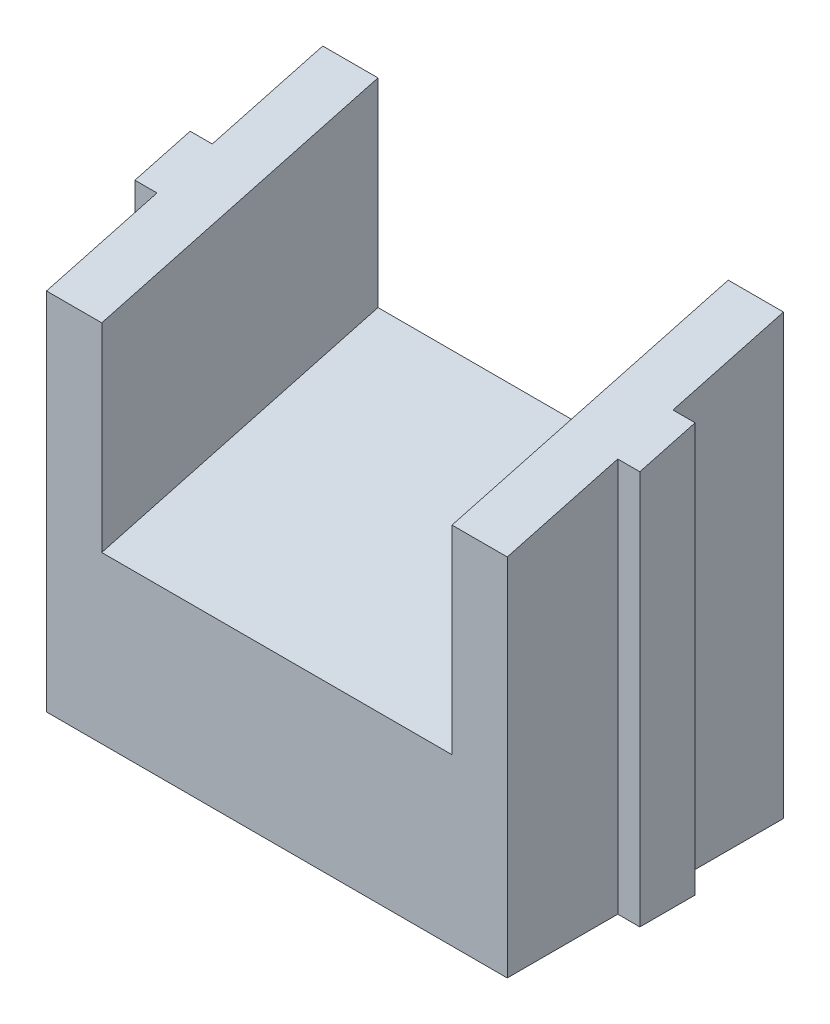
ISO-10303-21;
HEADER;
FILE_DESCRIPTION(('STEP AP214'),'2;1');
FILE_NAME('part.step','',(''),(''),'','','');
FILE_SCHEMA(('AUTOMOTIVE_DESIGN { 1 0 10303 214 1 1 1 1 }'));
ENDSEC;
DATA;
#1=APPLICATION_CONTEXT('core data for automotive mechanical design processes');
#2=APPLICATION_PROTOCOL_DEFINITION('international standard','automotive_design',2000,#1);
#3=PRODUCT_CONTEXT('',#1,'mechanical');
#4=PRODUCT('Part','Part','',(#3));
#5=PRODUCT_RELATED_PRODUCT_CATEGORY('part','',(#4));
#6=PRODUCT_DEFINITION_FORMATION('','',#4);
#7=PRODUCT_DEFINITION_CONTEXT('part definition',#1,'design');
#8=PRODUCT_DEFINITION('design','',#6,#7);
#9=PRODUCT_DEFINITION_SHAPE('','',#8);
#10=(LENGTH_UNIT() NAMED_UNIT(*) SI_UNIT(.MILLI.,.METRE.));
#11=(NAMED_UNIT(*) PLANE_ANGLE_UNIT() SI_UNIT($,.RADIAN.));
#12=(NAMED_UNIT(*) SI_UNIT($,.STERADIAN.) SOLID_ANGLE_UNIT());
#13=UNCERTAINTY_MEASURE_WITH_UNIT(LENGTH_MEASURE(1.E-05),#10,'distance_accuracy_value','');
#14=(GEOMETRIC_REPRESENTATION_CONTEXT(3) GLOBAL_UNCERTAINTY_ASSIGNED_CONTEXT((#13)) GLOBAL_UNIT_ASSIGNED_CONTEXT((#10,
#11,#12)) REPRESENTATION_CONTEXT('',''));
#15=CARTESIAN_POINT('',(0.,0.,0.));
#16=DIRECTION('',(0.,0.,1.));
#17=DIRECTION('',(1.,0.,0.));
#18=AXIS2_PLACEMENT_3D('',#15,#16,#17);
#19=CARTESIAN_POINT('',(0.,15.,0.));
#20=DIRECTION('',(-1.,0.,0.));
#21=DIRECTION('',(0.,0.,1.));
#22=AXIS2_PLACEMENT_3D('',#19,#20,#21);
#23=PLANE('',#22);
#24=DIRECTION('',(0.,-0.258819045102522,0.965925826289068));
#25=VECTOR('',#24,1.);
#26=CARTESIAN_POINT('',(0.,31.9951905283833,3.75000000000001));
#27=LINE('',#26,#25);
#28=CARTESIAN_POINT('',(0.,35.6794919243112,-10.));
#29=VERTEX_POINT('',#28);
#30=CARTESIAN_POINT('',(0.,33.,0.));
#31=VERTEX_POINT('',#30);
#32=EDGE_CURVE('E175',#29,#31,#27,.T.);
#33=ORIENTED_EDGE('',*,*,#32,.F.);
#34=DIRECTION('',(0.,-1.,0.));
#35=VECTOR('',#34,1.);
#36=CARTESIAN_POINT('',(0.,15.,-10.));
#37=LINE('',#36,#35);
#38=CARTESIAN_POINT('',(0.,0.,-10.));
#39=VERTEX_POINT('',#38);
#40=EDGE_CURVE('E49',#29,#39,#37,.T.);
#41=ORIENTED_EDGE('',*,*,#40,.T.);
#42=DIRECTION('',(0.,0.,-1.));
#43=VECTOR('',#42,1.);
#44=CARTESIAN_POINT('',(0.,0.,0.));
#45=LINE('',#44,#43);
#46=CARTESIAN_POINT('',(0.,0.,0.));
#47=VERTEX_POINT('',#46);
#48=EDGE_CURVE('E203',#47,#39,#45,.T.);
#49=ORIENTED_EDGE('',*,*,#48,.F.);
#50=DIRECTION('',(0.,-1.,0.));
#51=VECTOR('',#50,1.);
#52=CARTESIAN_POINT('',(0.,15.,0.));
#53=LINE('',#52,#51);
#54=EDGE_CURVE('E237',#31,#47,#53,.T.);
#55=ORIENTED_EDGE('',*,*,#54,.F.);
#56=EDGE_LOOP('',(#33,#41,#49,#55));
#57=FACE_BOUND('',#56,.T.);
#58=ADVANCED_FACE('F34',(#57),#23,.T.);
#59=DIRECTION('',(0.,-1.,0.));
#60=VECTOR('',#59,1.);
#61=CARTESIAN_POINT('',(0.,15.,-15.));
#62=LINE('',#61,#60);
#63=CARTESIAN_POINT('',(0.,37.0192378864669,-15.));
#64=VERTEX_POINT('',#63);
#65=CARTESIAN_POINT('',(0.,0.,-15.));
#66=VERTEX_POINT('',#65);
#67=EDGE_CURVE('E149',#64,#66,#62,.T.);
#68=ORIENTED_EDGE('',*,*,#67,.F.);
#69=CARTESIAN_POINT('',(0.,39.6987298107781,-25.));
#70=VERTEX_POINT('',#69);
#71=EDGE_CURVE('E153',#70,#64,#27,.T.);
#72=ORIENTED_EDGE('',*,*,#71,.F.);
#73=DIRECTION('',(0.,-1.,0.));
#74=VECTOR('',#73,1.);
#75=CARTESIAN_POINT('',(0.,15.,-25.));
#76=LINE('',#75,#74);
#77=CARTESIAN_POINT('',(0.,0.,-25.));
#78=VERTEX_POINT('',#77);
#79=EDGE_CURVE('E159',#70,#78,#76,.T.);
#80=ORIENTED_EDGE('',*,*,#79,.T.);
#81=EDGE_CURVE('E155',#66,#78,#45,.T.);
#82=ORIENTED_EDGE('',*,*,#81,.F.);
#83=EDGE_LOOP('',(#68,#72,#80,#82));
#84=FACE_BOUND('',#83,.T.);
#85=ADVANCED_FACE('F151',(#84),#23,.T.);
#86=CARTESIAN_POINT('',(41.7,15.,0.));
#87=DIRECTION('',(-1.,0.,0.));
#88=DIRECTION('',(0.,0.,1.));
#89=AXIS2_PLACEMENT_3D('',#86,#87,#88);
#90=PLANE('',#89);
#91=DIRECTION('',(0.,0.258819045102522,-0.965925826289068));
#92=VECTOR('',#91,1.);
#93=CARTESIAN_POINT('',(41.7,31.9951905283833,3.75000000000001));
#94=LINE('',#93,#92);
#95=CARTESIAN_POINT('',(41.7,37.0192378864669,-15.));
#96=VERTEX_POINT('',#95);
#97=CARTESIAN_POINT('',(41.7,39.6987298107781,-25.));
#98=VERTEX_POINT('',#97);
#99=EDGE_CURVE('E271',#96,#98,#94,.T.);
#100=ORIENTED_EDGE('',*,*,#99,.F.);
#101=DIRECTION('',(0.,-1.,0.));
#102=VECTOR('',#101,1.);
#103=CARTESIAN_POINT('',(41.7,15.,-15.));
#104=LINE('',#103,#102);
#105=CARTESIAN_POINT('',(41.7,0.,-15.));
#106=VERTEX_POINT('',#105);
#107=EDGE_CURVE('E57',#96,#106,#104,.T.);
#108=ORIENTED_EDGE('',*,*,#107,.T.);
#109=DIRECTION('',(0.,0.,-1.));
#110=VECTOR('',#109,1.);
#111=CARTESIAN_POINT('',(41.7,0.,0.));
#112=LINE('',#111,#110);
#113=CARTESIAN_POINT('',(41.7,0.,-25.));
#114=VERTEX_POINT('',#113);
#115=EDGE_CURVE('E211',#106,#114,#112,.T.);
#116=ORIENTED_EDGE('',*,*,#115,.T.);
#117=DIRECTION('',(0.,-1.,0.));
#118=VECTOR('',#117,1.);
#119=CARTESIAN_POINT('',(41.7,15.,-25.));
#120=LINE('',#119,#118);
#121=EDGE_CURVE('E224',#98,#114,#120,.T.);
#122=ORIENTED_EDGE('',*,*,#121,.F.);
#123=EDGE_LOOP('',(#100,#108,#116,#122));
#124=FACE_BOUND('',#123,.T.);
#125=ADVANCED_FACE('F332',(#124),#90,.F.);
#126=DIRECTION('',(0.,-1.,0.));
#127=VECTOR('',#126,1.);
#128=CARTESIAN_POINT('',(41.7,15.,-10.));
#129=LINE('',#128,#127);
#130=CARTESIAN_POINT('',(41.7,35.6794919243112,-10.));
#131=VERTEX_POINT('',#130);
#132=CARTESIAN_POINT('',(41.7,0.,-10.));
#133=VERTEX_POINT('',#132);
#134=EDGE_CURVE('E231',#131,#133,#129,.T.);
#135=ORIENTED_EDGE('',*,*,#134,.F.);
#136=CARTESIAN_POINT('',(41.7,33.,0.));
#137=VERTEX_POINT('',#136);
#138=EDGE_CURVE('E272',#137,#131,#94,.T.);
#139=ORIENTED_EDGE('',*,*,#138,.F.);
#140=DIRECTION('',(0.,-1.,0.));
#141=VECTOR('',#140,1.);
#142=CARTESIAN_POINT('',(41.7,15.,0.));
#143=LINE('',#142,#141);
#144=CARTESIAN_POINT('',(41.7,0.,0.));
#145=VERTEX_POINT('',#144);
#146=EDGE_CURVE('E234',#137,#145,#143,.T.);
#147=ORIENTED_EDGE('',*,*,#146,.T.);
#148=EDGE_CURVE('E208',#145,#133,#112,.T.);
#149=ORIENTED_EDGE('',*,*,#148,.T.);
#150=EDGE_LOOP('',(#135,#139,#147,#149));
#151=FACE_BOUND('',#150,.T.);
#152=ADVANCED_FACE('F305',(#151),#90,.F.);
#153=CARTESIAN_POINT('',(0.,15.,-15.));
#154=DIRECTION('',(0.,0.,1.));
#155=DIRECTION('',(1.,0.,0.));
#156=AXIS2_PLACEMENT_3D('',#153,#154,#155);
#157=PLANE('',#156);
#158=DIRECTION('',(-1.,0.,0.));
#159=VECTOR('',#158,1.);
#160=CARTESIAN_POINT('',(0.,0.,-15.));
#161=LINE('',#160,#159);
#162=CARTESIAN_POINT('',(-2.,0.,-15.));
#163=VERTEX_POINT('',#162);
#164=EDGE_CURVE('E193',#66,#163,#161,.T.);
#165=ORIENTED_EDGE('',*,*,#164,.T.);
#166=DIRECTION('',(0.,-1.,0.));
#167=VECTOR('',#166,1.);
#168=CARTESIAN_POINT('',(-2.,15.,-15.));
#169=LINE('',#168,#167);
#170=CARTESIAN_POINT('',(-2.,37.0192378864669,-15.));
#171=VERTEX_POINT('',#170);
#172=EDGE_CURVE('E11',#171,#163,#169,.T.);
#173=ORIENTED_EDGE('',*,*,#172,.F.);
#174=DIRECTION('',(-1.,0.,0.));
#175=VECTOR('',#174,1.);
#176=CARTESIAN_POINT('',(0.,37.0192378864669,-15.));
#177=LINE('',#176,#175);
#178=EDGE_CURVE('E163',#64,#171,#177,.T.);
#179=ORIENTED_EDGE('',*,*,#178,.F.);
#180=ORIENTED_EDGE('',*,*,#67,.T.);
#181=EDGE_LOOP('',(#165,#173,#179,#180));
#182=FACE_BOUND('',#181,.T.);
#183=ADVANCED_FACE('F36',(#182),#157,.F.);
#184=CARTESIAN_POINT('',(-2.,15.,0.));
#185=DIRECTION('',(1.,0.,0.));
#186=DIRECTION('',(0.,0.,-1.));
#187=AXIS2_PLACEMENT_3D('',#184,#185,#186);
#188=PLANE('',#187);
#189=DIRECTION('',(0.,0.,1.));
#190=VECTOR('',#189,1.);
#191=CARTESIAN_POINT('',(-2.,0.,0.));
#192=LINE('',#191,#190);
#193=CARTESIAN_POINT('',(-2.,0.,-10.));
#194=VERTEX_POINT('',#193);
#195=EDGE_CURVE('E197',#163,#194,#192,.T.);
#196=ORIENTED_EDGE('',*,*,#195,.T.);
#197=DIRECTION('',(0.,-1.,0.));
#198=VECTOR('',#197,1.);
#199=CARTESIAN_POINT('',(-2.,15.,-10.));
#200=LINE('',#199,#198);
#201=CARTESIAN_POINT('',(-2.,35.6794919243112,-10.));
#202=VERTEX_POINT('',#201);
#203=EDGE_CURVE('E42',#202,#194,#200,.T.);
#204=ORIENTED_EDGE('',*,*,#203,.F.);
#205=DIRECTION('',(0.,-0.258819045102522,0.965925826289068));
#206=VECTOR('',#205,1.);
#207=CARTESIAN_POINT('',(-2.,37.341465268724,-16.2025689621735));
#208=LINE('',#207,#206);
#209=EDGE_CURVE('E167',#171,#202,#208,.T.);
#210=ORIENTED_EDGE('',*,*,#209,.F.);
#211=ORIENTED_EDGE('',*,*,#172,.T.);
#212=EDGE_LOOP('',(#196,#204,#210,#211));
#213=FACE_BOUND('',#212,.T.);
#214=ADVANCED_FACE('F242',(#213),#188,.F.);
#215=CARTESIAN_POINT('',(0.,15.,-10.));
#216=DIRECTION('',(0.,0.,1.));
#217=DIRECTION('',(1.,0.,0.));
#218=AXIS2_PLACEMENT_3D('',#215,#216,#217);
#219=PLANE('',#218);
#220=DIRECTION('',(-1.,0.,0.));
#221=VECTOR('',#220,1.);
#222=CARTESIAN_POINT('',(0.,0.,-10.));
#223=LINE('',#222,#221);
#224=EDGE_CURVE('E200',#39,#194,#223,.T.);
#225=ORIENTED_EDGE('',*,*,#224,.F.);
#226=ORIENTED_EDGE('',*,*,#40,.F.);
#227=DIRECTION('',(1.,0.,0.));
#228=VECTOR('',#227,1.);
#229=CARTESIAN_POINT('',(-2.,35.6794919243112,-10.));
#230=LINE('',#229,#228);
#231=EDGE_CURVE('E240',#202,#29,#230,.T.);
#232=ORIENTED_EDGE('',*,*,#231,.F.);
#233=ORIENTED_EDGE('',*,*,#203,.T.);
#234=EDGE_LOOP('',(#225,#226,#232,#233));
#235=FACE_BOUND('',#234,.T.);
#236=ADVANCED_FACE('F239',(#235),#219,.T.);
#237=CARTESIAN_POINT('',(0.,15.,0.));
#238=DIRECTION('',(0.,0.,-1.));
#239=DIRECTION('',(-1.,0.,0.));
#240=AXIS2_PLACEMENT_3D('',#237,#238,#239);
#241=PLANE('',#240);
#242=DIRECTION('',(1.,0.,0.));
#243=VECTOR('',#242,1.);
#244=CARTESIAN_POINT('',(0.,0.,0.));
#245=LINE('',#244,#243);
#246=EDGE_CURVE('E206',#47,#145,#245,.T.);
#247=ORIENTED_EDGE('',*,*,#246,.T.);
#248=ORIENTED_EDGE('',*,*,#146,.F.);
#249=DIRECTION('',(1.,0.,0.));
#250=VECTOR('',#249,1.);
#251=CARTESIAN_POINT('',(0.,33.,0.));
#252=LINE('',#251,#250);
#253=CARTESIAN_POINT('',(36.7,33.,0.));
#254=VERTEX_POINT('',#253);
#255=EDGE_CURVE('E268',#254,#137,#252,.T.);
#256=ORIENTED_EDGE('',*,*,#255,.F.);
#257=DIRECTION('',(0.,-1.,0.));
#258=VECTOR('',#257,1.);
#259=CARTESIAN_POINT('',(36.7,33.,0.));
#260=LINE('',#259,#258);
#261=CARTESIAN_POINT('',(36.7,15.,0.));
#262=VERTEX_POINT('',#261);
#263=EDGE_CURVE('E186',#254,#262,#260,.T.);
#264=ORIENTED_EDGE('',*,*,#263,.T.);
#265=DIRECTION('',(1.,0.,0.));
#266=VECTOR('',#265,1.);
#267=CARTESIAN_POINT('',(0.,15.,0.));
#268=LINE('',#267,#266);
#269=CARTESIAN_POINT('',(5.,15.,0.));
#270=VERTEX_POINT('',#269);
#271=EDGE_CURVE('E160',#270,#262,#268,.T.);
#272=ORIENTED_EDGE('',*,*,#271,.F.);
#273=DIRECTION('',(0.,-1.,0.));
#274=VECTOR('',#273,1.);
#275=CARTESIAN_POINT('',(5.,33.,0.));
#276=LINE('',#275,#274);
#277=CARTESIAN_POINT('',(5.,33.,0.));
#278=VERTEX_POINT('',#277);
#279=EDGE_CURVE('E178',#278,#270,#276,.T.);
#280=ORIENTED_EDGE('',*,*,#279,.F.);
#281=DIRECTION('',(1.,0.,0.));
#282=VECTOR('',#281,1.);
#283=CARTESIAN_POINT('',(0.,33.,0.));
#284=LINE('',#283,#282);
#285=EDGE_CURVE('E185',#31,#278,#284,.T.);
#286=ORIENTED_EDGE('',*,*,#285,.F.);
#287=ORIENTED_EDGE('',*,*,#54,.T.);
#288=EDGE_LOOP('',(#247,#248,#256,#264,#272,#280,#286,#287));
#289=FACE_BOUND('',#288,.T.);
#290=ADVANCED_FACE('F308',(#289),#241,.F.);
#291=CARTESIAN_POINT('',(0.,15.,-10.));
#292=DIRECTION('',(0.,0.,-1.));
#293=DIRECTION('',(-1.,0.,0.));
#294=AXIS2_PLACEMENT_3D('',#291,#292,#293);
#295=PLANE('',#294);
#296=DIRECTION('',(1.,0.,0.));
#297=VECTOR('',#296,1.);
#298=CARTESIAN_POINT('',(0.,0.,-10.));
#299=LINE('',#298,#297);
#300=CARTESIAN_POINT('',(43.7,0.,-10.));
#301=VERTEX_POINT('',#300);
#302=EDGE_CURVE('E210',#133,#301,#299,.T.);
#303=ORIENTED_EDGE('',*,*,#302,.T.);
#304=DIRECTION('',(0.,-1.,0.));
#305=VECTOR('',#304,1.);
#306=CARTESIAN_POINT('',(43.7,15.,-10.));
#307=LINE('',#306,#305);
#308=CARTESIAN_POINT('',(43.7,35.6794919243112,-10.));
#309=VERTEX_POINT('',#308);
#310=EDGE_CURVE('E229',#309,#301,#307,.T.);
#311=ORIENTED_EDGE('',*,*,#310,.F.);
#312=DIRECTION('',(1.,0.,0.));
#313=VECTOR('',#312,1.);
#314=CARTESIAN_POINT('',(41.7,35.6794919243112,-10.));
#315=LINE('',#314,#313);
#316=EDGE_CURVE('E260',#131,#309,#315,.T.);
#317=ORIENTED_EDGE('',*,*,#316,.F.);
#318=ORIENTED_EDGE('',*,*,#134,.T.);
#319=EDGE_LOOP('',(#303,#311,#317,#318));
#320=FACE_BOUND('',#319,.T.);
#321=ADVANCED_FACE('F301',(#320),#295,.F.);
#322=CARTESIAN_POINT('',(43.7,15.,0.));
#323=DIRECTION('',(1.,0.,0.));
#324=DIRECTION('',(0.,0.,-1.));
#325=AXIS2_PLACEMENT_3D('',#322,#323,#324);
#326=PLANE('',#325);
#327=DIRECTION('',(0.,0.,1.));
#328=VECTOR('',#327,1.);
#329=CARTESIAN_POINT('',(43.7,0.,0.));
#330=LINE('',#329,#328);
#331=CARTESIAN_POINT('',(43.7,0.,-15.));
#332=VERTEX_POINT('',#331);
#333=EDGE_CURVE('E214',#332,#301,#330,.T.);
#334=ORIENTED_EDGE('',*,*,#333,.F.);
#335=DIRECTION('',(0.,-1.,0.));
#336=VECTOR('',#335,1.);
#337=CARTESIAN_POINT('',(43.7,15.,-15.));
#338=LINE('',#337,#336);
#339=CARTESIAN_POINT('',(43.7,37.0192378864669,-15.));
#340=VERTEX_POINT('',#339);
#341=EDGE_CURVE('E227',#340,#332,#338,.T.);
#342=ORIENTED_EDGE('',*,*,#341,.F.);
#343=DIRECTION('',(0.,0.258819045102522,-0.965925826289068));
#344=VECTOR('',#343,1.);
#345=CARTESIAN_POINT('',(43.7,36.091465268724,-11.5375054527124));
#346=LINE('',#345,#344);
#347=EDGE_CURVE('E253',#309,#340,#346,.T.);
#348=ORIENTED_EDGE('',*,*,#347,.F.);
#349=ORIENTED_EDGE('',*,*,#310,.T.);
#350=EDGE_LOOP('',(#334,#342,#348,#349));
#351=FACE_BOUND('',#350,.T.);
#352=ADVANCED_FACE('F298',(#351),#326,.T.);
#353=CARTESIAN_POINT('',(0.,15.,-15.));
#354=DIRECTION('',(0.,0.,-1.));
#355=DIRECTION('',(-1.,0.,0.));
#356=AXIS2_PLACEMENT_3D('',#353,#354,#355);
#357=PLANE('',#356);
#358=DIRECTION('',(1.,0.,0.));
#359=VECTOR('',#358,1.);
#360=CARTESIAN_POINT('',(0.,0.,-15.));
#361=LINE('',#360,#359);
#362=EDGE_CURVE('E217',#106,#332,#361,.T.);
#363=ORIENTED_EDGE('',*,*,#362,.F.);
#364=ORIENTED_EDGE('',*,*,#107,.F.);
#365=DIRECTION('',(-1.,0.,0.));
#366=VECTOR('',#365,1.);
#367=CARTESIAN_POINT('',(43.7,37.0192378864669,-15.));
#368=LINE('',#367,#366);
#369=EDGE_CURVE('E256',#340,#96,#368,.T.);
#370=ORIENTED_EDGE('',*,*,#369,.F.);
#371=ORIENTED_EDGE('',*,*,#341,.T.);
#372=EDGE_LOOP('',(#363,#364,#370,#371));
#373=FACE_BOUND('',#372,.T.);
#374=ADVANCED_FACE('F294',(#373),#357,.T.);
#375=CARTESIAN_POINT('',(0.,15.,-25.));
#376=DIRECTION('',(0.,0.,-1.));
#377=DIRECTION('',(-1.,0.,0.));
#378=AXIS2_PLACEMENT_3D('',#375,#376,#377);
#379=PLANE('',#378);
#380=DIRECTION('',(1.,0.,0.));
#381=VECTOR('',#380,1.);
#382=CARTESIAN_POINT('',(0.,0.,-25.));
#383=LINE('',#382,#381);
#384=EDGE_CURVE('E220',#78,#114,#383,.T.);
#385=ORIENTED_EDGE('',*,*,#384,.F.);
#386=ORIENTED_EDGE('',*,*,#79,.F.);
#387=DIRECTION('',(-1.,0.,0.));
#388=VECTOR('',#387,1.);
#389=CARTESIAN_POINT('',(0.,39.6987298107781,-25.));
#390=LINE('',#389,#388);
#391=CARTESIAN_POINT('',(5.,39.6987298107781,-25.));
#392=VERTEX_POINT('',#391);
#393=EDGE_CURVE('E173',#392,#70,#390,.T.);
#394=ORIENTED_EDGE('',*,*,#393,.F.);
#395=DIRECTION('',(0.,-1.,0.));
#396=VECTOR('',#395,1.);
#397=CARTESIAN_POINT('',(5.,39.6987298107781,-25.));
#398=LINE('',#397,#396);
#399=CARTESIAN_POINT('',(5.,21.6987298107781,-25.));
#400=VERTEX_POINT('',#399);
#401=EDGE_CURVE('E174',#392,#400,#398,.T.);
#402=ORIENTED_EDGE('',*,*,#401,.T.);
#403=DIRECTION('',(1.,0.,0.));
#404=VECTOR('',#403,1.);
#405=CARTESIAN_POINT('',(-25.8819045102521,21.6987298107781,-25.));
#406=LINE('',#405,#404);
#407=CARTESIAN_POINT('',(36.7,21.6987298107781,-25.));
#408=VERTEX_POINT('',#407);
#409=EDGE_CURVE('E190',#400,#408,#406,.T.);
#410=ORIENTED_EDGE('',*,*,#409,.T.);
#411=DIRECTION('',(0.,-1.,0.));
#412=VECTOR('',#411,1.);
#413=CARTESIAN_POINT('',(36.7,39.6987298107781,-25.));
#414=LINE('',#413,#412);
#415=CARTESIAN_POINT('',(36.7,39.6987298107781,-25.));
#416=VERTEX_POINT('',#415);
#417=EDGE_CURVE('E277',#416,#408,#414,.T.);
#418=ORIENTED_EDGE('',*,*,#417,.F.);
#419=DIRECTION('',(-1.,0.,0.));
#420=VECTOR('',#419,1.);
#421=CARTESIAN_POINT('',(0.,39.6987298107781,-25.));
#422=LINE('',#421,#420);
#423=EDGE_CURVE('E275',#98,#416,#422,.T.);
#424=ORIENTED_EDGE('',*,*,#423,.F.);
#425=ORIENTED_EDGE('',*,*,#121,.T.);
#426=EDGE_LOOP('',(#385,#386,#394,#402,#410,#418,#424,#425));
#427=FACE_BOUND('',#426,.T.);
#428=ADVANCED_FACE('F288',(#427),#379,.T.);
#429=CARTESIAN_POINT('',(0.,0.,0.));
#430=DIRECTION('',(0.,1.,0.));
#431=DIRECTION('',(0.,0.,1.));
#432=AXIS2_PLACEMENT_3D('',#429,#430,#431);
#433=PLANE('',#432);
#434=ORIENTED_EDGE('',*,*,#164,.F.);
#435=ORIENTED_EDGE('',*,*,#81,.T.);
#436=ORIENTED_EDGE('',*,*,#384,.T.);
#437=ORIENTED_EDGE('',*,*,#115,.F.);
#438=ORIENTED_EDGE('',*,*,#362,.T.);
#439=ORIENTED_EDGE('',*,*,#333,.T.);
#440=ORIENTED_EDGE('',*,*,#302,.F.);
#441=ORIENTED_EDGE('',*,*,#148,.F.);
#442=ORIENTED_EDGE('',*,*,#246,.F.);
#443=ORIENTED_EDGE('',*,*,#48,.T.);
#444=ORIENTED_EDGE('',*,*,#224,.T.);
#445=ORIENTED_EDGE('',*,*,#195,.F.);
#446=EDGE_LOOP('',(#434,#435,#436,#437,#438,#439,#440,#441,#442,#443,#444,#445));
#447=FACE_BOUND('',#446,.T.);
#448=ADVANCED_FACE('F244',(#447),#433,.F.);
#449=CARTESIAN_POINT('',(-25.8819045102521,15.,0.));
#450=DIRECTION('',(0.,0.965925826289068,0.258819045102522));
#451=DIRECTION('',(0.,-0.258819045102522,0.965925826289068));
#452=AXIS2_PLACEMENT_3D('',#449,#450,#451);
#453=PLANE('',#452);
#454=DIRECTION('',(0.,0.258819045102522,-0.965925826289068));
#455=VECTOR('',#454,1.);
#456=CARTESIAN_POINT('',(36.7,13.9951905283833,3.75000000000001));
#457=LINE('',#456,#455);
#458=EDGE_CURVE('E263',#262,#408,#457,.T.);
#459=ORIENTED_EDGE('',*,*,#458,.T.);
#460=ORIENTED_EDGE('',*,*,#409,.F.);
#461=DIRECTION('',(0.,0.258819045102522,-0.965925826289068));
#462=VECTOR('',#461,1.);
#463=CARTESIAN_POINT('',(5.,13.9951905283833,3.75000000000001));
#464=LINE('',#463,#462);
#465=EDGE_CURVE('E183',#270,#400,#464,.T.);
#466=ORIENTED_EDGE('',*,*,#465,.F.);
#467=ORIENTED_EDGE('',*,*,#271,.T.);
#468=EDGE_LOOP('',(#459,#460,#466,#467));
#469=FACE_BOUND('',#468,.T.);
#470=ADVANCED_FACE('F318',(#469),#453,.T.);
#471=CARTESIAN_POINT('',(5.,31.9951905283833,3.75000000000001));
#472=DIRECTION('',(-1.,0.,0.));
#473=DIRECTION('',(0.,0.,1.));
#474=AXIS2_PLACEMENT_3D('',#471,#472,#473);
#475=PLANE('',#474);
#476=ORIENTED_EDGE('',*,*,#465,.T.);
#477=ORIENTED_EDGE('',*,*,#401,.F.);
#478=DIRECTION('',(0.,0.258819045102522,-0.965925826289068));
#479=VECTOR('',#478,1.);
#480=CARTESIAN_POINT('',(5.,31.9951905283833,3.75000000000001));
#481=LINE('',#480,#479);
#482=EDGE_CURVE('E282',#278,#392,#481,.T.);
#483=ORIENTED_EDGE('',*,*,#482,.F.);
#484=ORIENTED_EDGE('',*,*,#279,.T.);
#485=EDGE_LOOP('',(#476,#477,#483,#484));
#486=FACE_BOUND('',#485,.T.);
#487=ADVANCED_FACE('F285',(#486),#475,.F.);
#488=CARTESIAN_POINT('',(0.,31.9951905283833,3.75000000000001));
#489=DIRECTION('',(0.,0.965925826289068,0.258819045102522));
#490=DIRECTION('',(0.,-0.258819045102522,0.965925826289068));
#491=AXIS2_PLACEMENT_3D('',#488,#489,#490);
#492=PLANE('',#491);
#493=ORIENTED_EDGE('',*,*,#285,.T.);
#494=ORIENTED_EDGE('',*,*,#482,.T.);
#495=ORIENTED_EDGE('',*,*,#393,.T.);
#496=ORIENTED_EDGE('',*,*,#71,.T.);
#497=ORIENTED_EDGE('',*,*,#178,.T.);
#498=ORIENTED_EDGE('',*,*,#209,.T.);
#499=ORIENTED_EDGE('',*,*,#231,.T.);
#500=ORIENTED_EDGE('',*,*,#32,.T.);
#501=EDGE_LOOP('',(#493,#494,#495,#496,#497,#498,#499,#500));
#502=FACE_BOUND('',#501,.T.);
#503=ADVANCED_FACE('F171',(#502),#492,.T.);
#504=CARTESIAN_POINT('',(36.7,31.9951905283833,3.75000000000001));
#505=DIRECTION('',(-1.,0.,0.));
#506=DIRECTION('',(0.,0.,1.));
#507=AXIS2_PLACEMENT_3D('',#504,#505,#506);
#508=PLANE('',#507);
#509=ORIENTED_EDGE('',*,*,#458,.F.);
#510=ORIENTED_EDGE('',*,*,#263,.F.);
#511=DIRECTION('',(0.,0.258819045102522,-0.965925826289068));
#512=VECTOR('',#511,1.);
#513=CARTESIAN_POINT('',(36.7,31.9951905283833,3.75000000000001));
#514=LINE('',#513,#512);
#515=EDGE_CURVE('E265',#254,#416,#514,.T.);
#516=ORIENTED_EDGE('',*,*,#515,.T.);
#517=ORIENTED_EDGE('',*,*,#417,.T.);
#518=EDGE_LOOP('',(#509,#510,#516,#517));
#519=FACE_BOUND('',#518,.T.);
#520=ADVANCED_FACE('F315',(#519),#508,.T.);
#521=CARTESIAN_POINT('',(0.,31.9951905283833,3.75000000000001));
#522=DIRECTION('',(0.,0.965925826289068,0.258819045102522));
#523=DIRECTION('',(0.,-0.258819045102522,0.965925826289068));
#524=AXIS2_PLACEMENT_3D('',#521,#522,#523);
#525=PLANE('',#524);
#526=ORIENTED_EDGE('',*,*,#515,.F.);
#527=ORIENTED_EDGE('',*,*,#255,.T.);
#528=ORIENTED_EDGE('',*,*,#138,.T.);
#529=ORIENTED_EDGE('',*,*,#316,.T.);
#530=ORIENTED_EDGE('',*,*,#347,.T.);
#531=ORIENTED_EDGE('',*,*,#369,.T.);
#532=ORIENTED_EDGE('',*,*,#99,.T.);
#533=ORIENTED_EDGE('',*,*,#423,.T.);
#534=EDGE_LOOP('',(#526,#527,#528,#529,#530,#531,#532,#533));
#535=FACE_BOUND('',#534,.T.);
#536=ADVANCED_FACE('F311',(#535),#525,.T.);
#537=CLOSED_SHELL('',(#58,#85,#125,#152,#183,#214,#236,#290,#321,#352,#374,#428,#448,#470,#487,
#503,#520,#536));
#538=MANIFOLD_SOLID_BREP('B2',#537);
#539=ADVANCED_BREP_SHAPE_REPRESENTATION('',(#18,#538),#14);
#540=SHAPE_DEFINITION_REPRESENTATION(#9,#539);
ENDSEC;
END-ISO-10303-21;
